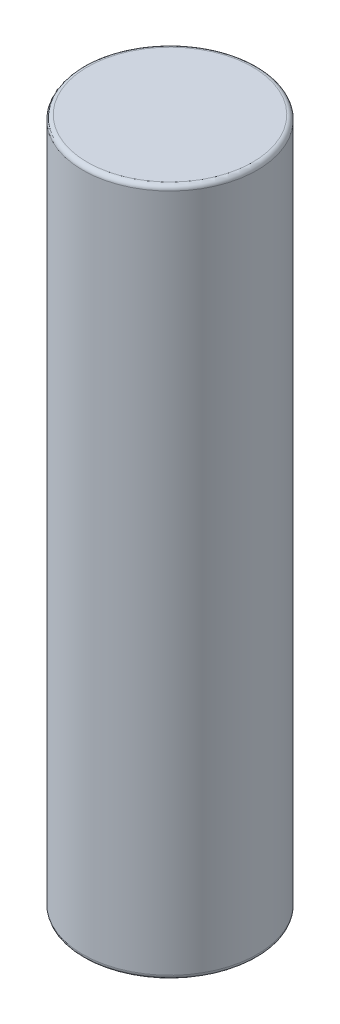
ISO-10303-21;
HEADER;
FILE_DESCRIPTION(('STEP AP214'),'2;1');
FILE_NAME('part.step','',(''),(''),'','','');
FILE_SCHEMA(('AUTOMOTIVE_DESIGN { 1 0 10303 214 1 1 1 1 }'));
ENDSEC;
DATA;
#1=APPLICATION_CONTEXT('core data for automotive mechanical design processes');
#2=APPLICATION_PROTOCOL_DEFINITION('international standard','automotive_design',2000,#1);
#3=PRODUCT_CONTEXT('',#1,'mechanical');
#4=PRODUCT('Part','Part','',(#3));
#5=PRODUCT_RELATED_PRODUCT_CATEGORY('part','',(#4));
#6=PRODUCT_DEFINITION_FORMATION('','',#4);
#7=PRODUCT_DEFINITION_CONTEXT('part definition',#1,'design');
#8=PRODUCT_DEFINITION('design','',#6,#7);
#9=PRODUCT_DEFINITION_SHAPE('','',#8);
#10=(LENGTH_UNIT() NAMED_UNIT(*) SI_UNIT(.MILLI.,.METRE.));
#11=(NAMED_UNIT(*) PLANE_ANGLE_UNIT() SI_UNIT($,.RADIAN.));
#12=(NAMED_UNIT(*) SI_UNIT($,.STERADIAN.) SOLID_ANGLE_UNIT());
#13=UNCERTAINTY_MEASURE_WITH_UNIT(LENGTH_MEASURE(1.E-05),#10,'distance_accuracy_value','');
#14=(GEOMETRIC_REPRESENTATION_CONTEXT(3) GLOBAL_UNCERTAINTY_ASSIGNED_CONTEXT((#13)) GLOBAL_UNIT_ASSIGNED_CONTEXT((#10,
#11,#12)) REPRESENTATION_CONTEXT('',''));
#15=CARTESIAN_POINT('',(0.,0.,0.));
#16=DIRECTION('',(0.,0.,1.));
#17=DIRECTION('',(1.,0.,0.));
#18=AXIS2_PLACEMENT_3D('',#15,#16,#17);
#19=CARTESIAN_POINT('',(0.,19.05,0.));
#20=DIRECTION('',(0.,-1.,0.));
#21=DIRECTION('',(0.,0.,-1.));
#22=AXIS2_PLACEMENT_3D('',#19,#20,#21);
#23=CYLINDRICAL_SURFACE('',#22,4.826);
#24=CARTESIAN_POINT('',(0.,-18.796,0.));
#25=DIRECTION('',(0.,1.,0.));
#26=DIRECTION('',(0.,0.,1.));
#27=AXIS2_PLACEMENT_3D('',#24,#25,#26);
#28=CIRCLE('',#27,4.826);
#29=CARTESIAN_POINT('',(0.,-18.796,-4.826));
#30=VERTEX_POINT('',#29);
#31=EDGE_CURVE('E42',#30,#30,#28,.T.);
#32=CARTESIAN_POINT('',(0.,18.796,0.));
#33=DIRECTION('',(0.,1.,0.));
#34=DIRECTION('',(0.,0.,1.));
#35=AXIS2_PLACEMENT_3D('',#32,#33,#34);
#36=CIRCLE('',#35,4.826);
#37=CARTESIAN_POINT('',(0.,18.796,-4.826));
#38=VERTEX_POINT('',#37);
#39=EDGE_CURVE('E46',#38,#38,#36,.F.);
#40=CARTESIAN_POINT('',(0.,-18.796,-4.826));
#41=CARTESIAN_POINT('',(0.,-18.4044166666667,-4.826));
#42=CARTESIAN_POINT('',(0.,-18.0128333333333,-4.826));
#43=CARTESIAN_POINT('',(0.,-17.2296666666667,-4.826));
#44=CARTESIAN_POINT('',(0.,-16.8380833333333,-4.826));
#45=CARTESIAN_POINT('',(0.,-16.0549166666667,-4.826));
#46=CARTESIAN_POINT('',(0.,-15.6633333333333,-4.826));
#47=CARTESIAN_POINT('',(0.,-14.8801666666667,-4.826));
#48=CARTESIAN_POINT('',(0.,-14.4885833333333,-4.826));
#49=CARTESIAN_POINT('',(0.,-13.7054166666667,-4.826));
#50=CARTESIAN_POINT('',(0.,-13.3138333333333,-4.826));
#51=CARTESIAN_POINT('',(0.,-12.5306666666667,-4.826));
#52=CARTESIAN_POINT('',(0.,-12.1390833333333,-4.826));
#53=CARTESIAN_POINT('',(0.,-11.3559166666667,-4.826));
#54=CARTESIAN_POINT('',(0.,-10.9643333333333,-4.826));
#55=CARTESIAN_POINT('',(0.,-10.1811666666667,-4.826));
#56=CARTESIAN_POINT('',(0.,-9.78958333333335,-4.826));
#57=CARTESIAN_POINT('',(0.,-9.00641666666668,-4.826));
#58=CARTESIAN_POINT('',(0.,-8.61483333333334,-4.826));
#59=CARTESIAN_POINT('',(0.,-7.83166666666668,-4.826));
#60=CARTESIAN_POINT('',(0.,-7.44008333333334,-4.826));
#61=CARTESIAN_POINT('',(0.,-6.65691666666668,-4.826));
#62=CARTESIAN_POINT('',(0.,-6.26533333333334,-4.826));
#63=CARTESIAN_POINT('',(0.,-5.48216666666668,-4.826));
#64=CARTESIAN_POINT('',(0.,-5.09058333333334,-4.826));
#65=CARTESIAN_POINT('',(0.,-4.30741666666667,-4.826));
#66=CARTESIAN_POINT('',(0.,-3.91583333333334,-4.826));
#67=CARTESIAN_POINT('',(0.,-3.13266666666667,-4.826));
#68=CARTESIAN_POINT('',(0.,-2.74108333333334,-4.826));
#69=CARTESIAN_POINT('',(0.,-1.95791666666667,-4.826));
#70=CARTESIAN_POINT('',(0.,-1.56633333333334,-4.826));
#71=CARTESIAN_POINT('',(0.,-0.783166666666675,-4.826));
#72=CARTESIAN_POINT('',(0.,-0.391583333333341,-4.826));
#73=CARTESIAN_POINT('',(0.,0.391583333333327,-4.826));
#74=CARTESIAN_POINT('',(0.,0.783166666666661,-4.826));
#75=CARTESIAN_POINT('',(0.,1.56633333333333,-4.826));
#76=CARTESIAN_POINT('',(0.,1.95791666666666,-4.826));
#77=CARTESIAN_POINT('',(0.,2.74108333333333,-4.826));
#78=CARTESIAN_POINT('',(0.,3.13266666666666,-4.826));
#79=CARTESIAN_POINT('',(0.,3.91583333333333,-4.826));
#80=CARTESIAN_POINT('',(0.,4.30741666666666,-4.826));
#81=CARTESIAN_POINT('',(0.,5.09058333333333,-4.826));
#82=CARTESIAN_POINT('',(0.,5.48216666666666,-4.826));
#83=CARTESIAN_POINT('',(0.,6.26533333333333,-4.826));
#84=CARTESIAN_POINT('',(0.,6.65691666666666,-4.826));
#85=CARTESIAN_POINT('',(0.,7.44008333333333,-4.826));
#86=CARTESIAN_POINT('',(0.,7.83166666666666,-4.826));
#87=CARTESIAN_POINT('',(0.,8.61483333333333,-4.826));
#88=CARTESIAN_POINT('',(0.,9.00641666666666,-4.826));
#89=CARTESIAN_POINT('',(0.,9.78958333333333,-4.826));
#90=CARTESIAN_POINT('',(0.,10.1811666666667,-4.826));
#91=CARTESIAN_POINT('',(0.,10.9643333333333,-4.826));
#92=CARTESIAN_POINT('',(0.,11.3559166666667,-4.826));
#93=CARTESIAN_POINT('',(0.,12.1390833333333,-4.826));
#94=CARTESIAN_POINT('',(0.,12.5306666666667,-4.826));
#95=CARTESIAN_POINT('',(0.,13.3138333333333,-4.826));
#96=CARTESIAN_POINT('',(0.,13.7054166666667,-4.826));
#97=CARTESIAN_POINT('',(0.,14.4885833333333,-4.826));
#98=CARTESIAN_POINT('',(0.,14.8801666666667,-4.826));
#99=CARTESIAN_POINT('',(0.,15.6633333333333,-4.826));
#100=CARTESIAN_POINT('',(0.,16.0549166666667,-4.826));
#101=CARTESIAN_POINT('',(0.,16.8380833333333,-4.826));
#102=CARTESIAN_POINT('',(0.,17.2296666666667,-4.826));
#103=CARTESIAN_POINT('',(0.,18.0128333333333,-4.826));
#104=CARTESIAN_POINT('',(0.,18.4044166666667,-4.826));
#105=CARTESIAN_POINT('',(0.,18.796,-4.826));
#106=B_SPLINE_CURVE_WITH_KNOTS('',3,(#40,#41,#42,#43,#44,#45,#46,#47,#48,#49,#50,#51,#52,#53,
#54,#55,#56,#57,#58,#59,#60,#61,#62,#63,#64,#65,#66,#67,#68,#69,#70,#71,#72,#73,#74,#75,#76,#77,
#78,#79,#80,#81,#82,#83,#84,#85,#86,#87,#88,#89,#90,#91,#92,#93,#94,#95,#96,#97,#98,#99,#100,
#101,#102,#103,#104,#105),.UNSPECIFIED.,.F.,.F.,(4,2,2,2,2,2,2,2,2,2,2,2,2,2,2,2,2,2,2,2,2,2,2,
2,2,2,2,2,2,2,2,2,4),(0.,1.17475,2.3495,3.52425,4.699,5.87375,7.0485,8.22325,9.398,10.57275,
11.7475,12.92225,14.097,15.27175,16.4465,17.62125,18.796,19.97075,21.1455,22.32025,23.495,
24.66975,25.8445,27.01925,28.194,29.36875,30.5435,31.71825,32.893,34.06775,35.2425,36.41725,
37.592),.UNSPECIFIED.);
#107=EDGE_CURVE('BSEAM31',#30,#38,#106,.T.);
#108=ORIENTED_EDGE('',*,*,#31,.T.);
#109=ORIENTED_EDGE('',*,*,#39,.T.);
#110=ORIENTED_EDGE('',*,*,#107,.T.);
#111=ORIENTED_EDGE('',*,*,#107,.F.);
#112=EDGE_LOOP('',(#108,#110,#109,#111));
#113=FACE_BOUND('',#112,.T.);
#114=ADVANCED_FACE('F31',(#113),#23,.T.);
#115=CARTESIAN_POINT('',(0.,19.05,0.));
#116=DIRECTION('',(0.,1.,0.));
#117=DIRECTION('',(0.,0.,1.));
#118=AXIS2_PLACEMENT_3D('',#115,#116,#117);
#119=PLANE('',#118);
#120=CARTESIAN_POINT('',(0.,19.05,0.));
#121=DIRECTION('',(0.,1.,0.));
#122=DIRECTION('',(0.,0.,1.));
#123=AXIS2_PLACEMENT_3D('',#120,#121,#122);
#124=CIRCLE('',#123,4.572);
#125=CARTESIAN_POINT('',(0.,19.05,4.572));
#126=VERTEX_POINT('',#125);
#127=EDGE_CURVE('E10',#126,#126,#124,.T.);
#128=ORIENTED_EDGE('',*,*,#127,.T.);
#129=EDGE_LOOP('',(#128));
#130=FACE_BOUND('',#129,.T.);
#131=ADVANCED_FACE('F62',(#130),#119,.T.);
#132=CARTESIAN_POINT('',(0.,-19.05,0.));
#133=DIRECTION('',(0.,1.,0.));
#134=DIRECTION('',(0.,0.,1.));
#135=AXIS2_PLACEMENT_3D('',#132,#133,#134);
#136=PLANE('',#135);
#137=CARTESIAN_POINT('',(0.,-19.05,0.));
#138=DIRECTION('',(0.,1.,0.));
#139=DIRECTION('',(0.,0.,1.));
#140=AXIS2_PLACEMENT_3D('',#137,#138,#139);
#141=CIRCLE('',#140,4.572);
#142=CARTESIAN_POINT('',(0.,-19.05,4.572));
#143=VERTEX_POINT('',#142);
#144=EDGE_CURVE('E38',#143,#143,#141,.F.);
#145=ORIENTED_EDGE('',*,*,#144,.T.);
#146=EDGE_LOOP('',(#145));
#147=FACE_BOUND('',#146,.T.);
#148=ADVANCED_FACE('F59',(#147),#136,.F.);
#149=CARTESIAN_POINT('',(0.,-18.796,0.));
#150=DIRECTION('',(0.,1.,0.));
#151=DIRECTION('',(0.,0.,1.));
#152=AXIS2_PLACEMENT_3D('',#149,#150,#151);
#153=TOROIDAL_SURFACE('',#152,4.572,0.254);
#154=ORIENTED_EDGE('',*,*,#144,.F.);
#155=EDGE_LOOP('',(#154));
#156=FACE_BOUND('',#155,.T.);
#157=ORIENTED_EDGE('',*,*,#31,.F.);
#158=EDGE_LOOP('',(#157));
#159=FACE_BOUND('',#158,.T.);
#160=ADVANCED_FACE('F55',(#156,#159),#153,.T.);
#161=CARTESIAN_POINT('',(0.,18.796,0.));
#162=DIRECTION('',(0.,1.,0.));
#163=DIRECTION('',(0.,0.,1.));
#164=AXIS2_PLACEMENT_3D('',#161,#162,#163);
#165=TOROIDAL_SURFACE('',#164,4.572,0.254);
#166=ORIENTED_EDGE('',*,*,#39,.F.);
#167=EDGE_LOOP('',(#166));
#168=FACE_BOUND('',#167,.T.);
#169=ORIENTED_EDGE('',*,*,#127,.F.);
#170=EDGE_LOOP('',(#169));
#171=FACE_BOUND('',#170,.T.);
#172=ADVANCED_FACE('F33',(#168,#171),#165,.T.);
#173=CLOSED_SHELL('',(#114,#131,#148,#160,#172));
#174=MANIFOLD_SOLID_BREP('B2',#173);
#175=ADVANCED_BREP_SHAPE_REPRESENTATION('',(#18,#174),#14);
#176=SHAPE_DEFINITION_REPRESENTATION(#9,#175);
ENDSEC;
END-ISO-10303-21;
